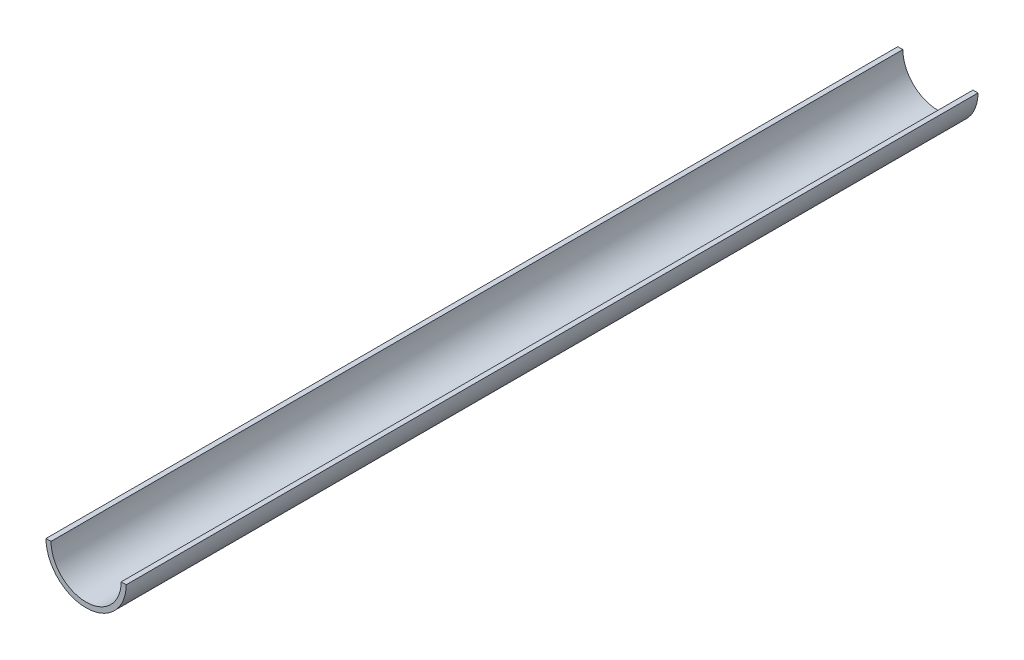
ISO-10303-21;
HEADER;
FILE_DESCRIPTION(('STEP AP214'),'2;1');
FILE_NAME('part.step','',(''),(''),'','','');
FILE_SCHEMA(('AUTOMOTIVE_DESIGN { 1 0 10303 214 1 1 1 1 }'));
ENDSEC;
DATA;
#1=APPLICATION_CONTEXT('core data for automotive mechanical design processes');
#2=APPLICATION_PROTOCOL_DEFINITION('international standard','automotive_design',2000,#1);
#3=PRODUCT_CONTEXT('',#1,'mechanical');
#4=PRODUCT('Part','Part','',(#3));
#5=PRODUCT_RELATED_PRODUCT_CATEGORY('part','',(#4));
#6=PRODUCT_DEFINITION_FORMATION('','',#4);
#7=PRODUCT_DEFINITION_CONTEXT('part definition',#1,'design');
#8=PRODUCT_DEFINITION('design','',#6,#7);
#9=PRODUCT_DEFINITION_SHAPE('','',#8);
#10=(LENGTH_UNIT() NAMED_UNIT(*) SI_UNIT(.MILLI.,.METRE.));
#11=(NAMED_UNIT(*) PLANE_ANGLE_UNIT() SI_UNIT($,.RADIAN.));
#12=(NAMED_UNIT(*) SI_UNIT($,.STERADIAN.) SOLID_ANGLE_UNIT());
#13=UNCERTAINTY_MEASURE_WITH_UNIT(LENGTH_MEASURE(1.E-05),#10,'distance_accuracy_value','');
#14=(GEOMETRIC_REPRESENTATION_CONTEXT(3) GLOBAL_UNCERTAINTY_ASSIGNED_CONTEXT((#13)) GLOBAL_UNIT_ASSIGNED_CONTEXT((#10,
#11,#12)) REPRESENTATION_CONTEXT('',''));
#15=CARTESIAN_POINT('',(0.,0.,0.));
#16=DIRECTION('',(0.,0.,1.));
#17=DIRECTION('',(1.,0.,0.));
#18=AXIS2_PLACEMENT_3D('',#15,#16,#17);
#19=CARTESIAN_POINT('',(0.,0.,0.));
#20=DIRECTION('',(0.,0.,1.));
#21=DIRECTION('',(1.,0.,0.));
#22=AXIS2_PLACEMENT_3D('',#19,#20,#21);
#23=PLANE('',#22);
#24=DIRECTION('',(1.,0.,0.));
#25=VECTOR('',#24,1.);
#26=CARTESIAN_POINT('',(-25.4,0.,0.));
#27=LINE('',#26,#25);
#28=CARTESIAN_POINT('',(22.225,0.,0.));
#29=VERTEX_POINT('',#28);
#30=CARTESIAN_POINT('',(25.4,0.,0.));
#31=VERTEX_POINT('',#30);
#32=EDGE_CURVE('E97',#29,#31,#27,.T.);
#33=ORIENTED_EDGE('',*,*,#32,.T.);
#34=CARTESIAN_POINT('',(0.,0.,0.));
#35=DIRECTION('',(0.,0.,1.));
#36=DIRECTION('',(1.,0.,0.));
#37=AXIS2_PLACEMENT_3D('',#34,#35,#36);
#38=CIRCLE('',#37,25.4);
#39=CARTESIAN_POINT('',(-25.4,0.,0.));
#40=VERTEX_POINT('',#39);
#41=EDGE_CURVE('E40',#40,#31,#38,.T.);
#42=ORIENTED_EDGE('',*,*,#41,.F.);
#43=CARTESIAN_POINT('',(-22.225,0.,0.));
#44=VERTEX_POINT('',#43);
#45=EDGE_CURVE('E98',#40,#44,#27,.T.);
#46=ORIENTED_EDGE('',*,*,#45,.T.);
#47=CARTESIAN_POINT('',(0.,0.,0.));
#48=DIRECTION('',(0.,0.,1.));
#49=DIRECTION('',(1.,0.,0.));
#50=AXIS2_PLACEMENT_3D('',#47,#48,#49);
#51=CIRCLE('',#50,22.225);
#52=EDGE_CURVE('E87',#44,#29,#51,.T.);
#53=ORIENTED_EDGE('',*,*,#52,.T.);
#54=EDGE_LOOP('',(#33,#42,#46,#53));
#55=FACE_BOUND('',#54,.T.);
#56=ADVANCED_FACE('F32',(#55),#23,.F.);
#57=CARTESIAN_POINT('',(0.,0.,914.4));
#58=DIRECTION('',(0.,0.,-1.));
#59=DIRECTION('',(-1.,0.,0.));
#60=AXIS2_PLACEMENT_3D('',#57,#58,#59);
#61=CYLINDRICAL_SURFACE('',#60,25.4);
#62=DIRECTION('',(0.,0.,-1.));
#63=VECTOR('',#62,1.);
#64=CARTESIAN_POINT('',(25.4,0.,539.75));
#65=LINE('',#64,#63);
#66=CARTESIAN_POINT('',(25.4,0.,539.75));
#67=VERTEX_POINT('',#66);
#68=EDGE_CURVE('E71',#67,#31,#65,.T.);
#69=ORIENTED_EDGE('',*,*,#68,.F.);
#70=CARTESIAN_POINT('',(0.,0.,539.75));
#71=DIRECTION('',(0.,0.,-1.));
#72=DIRECTION('',(-1.,0.,0.));
#73=AXIS2_PLACEMENT_3D('',#70,#71,#72);
#74=CIRCLE('',#73,25.4);
#75=CARTESIAN_POINT('',(-25.4,0.,539.75));
#76=VERTEX_POINT('',#75);
#77=EDGE_CURVE('E80',#67,#76,#74,.T.);
#78=ORIENTED_EDGE('',*,*,#77,.T.);
#79=DIRECTION('',(0.,0.,-1.));
#80=VECTOR('',#79,1.);
#81=CARTESIAN_POINT('',(-25.4,0.,539.75));
#82=LINE('',#81,#80);
#83=EDGE_CURVE('E47',#76,#40,#82,.T.);
#84=ORIENTED_EDGE('',*,*,#83,.T.);
#85=ORIENTED_EDGE('',*,*,#41,.T.);
#86=EDGE_LOOP('',(#69,#78,#84,#85));
#87=FACE_BOUND('',#86,.T.);
#88=ADVANCED_FACE('F34',(#87),#61,.T.);
#89=CARTESIAN_POINT('',(0.,0.,914.4));
#90=DIRECTION('',(0.,0.,-1.));
#91=DIRECTION('',(-1.,0.,0.));
#92=AXIS2_PLACEMENT_3D('',#89,#90,#91);
#93=CYLINDRICAL_SURFACE('',#92,22.225);
#94=CARTESIAN_POINT('',(0.,0.,539.75));
#95=DIRECTION('',(0.,0.,-1.));
#96=DIRECTION('',(-1.,0.,0.));
#97=AXIS2_PLACEMENT_3D('',#94,#95,#96);
#98=CIRCLE('',#97,22.225);
#99=CARTESIAN_POINT('',(22.225,0.,539.75));
#100=VERTEX_POINT('',#99);
#101=CARTESIAN_POINT('',(-22.225,0.,539.75));
#102=VERTEX_POINT('',#101);
#103=EDGE_CURVE('E85',#100,#102,#98,.T.);
#104=ORIENTED_EDGE('',*,*,#103,.F.);
#105=DIRECTION('',(0.,0.,-1.));
#106=VECTOR('',#105,1.);
#107=CARTESIAN_POINT('',(22.225,0.,914.4));
#108=LINE('',#107,#106);
#109=EDGE_CURVE('E54',#100,#29,#108,.T.);
#110=ORIENTED_EDGE('',*,*,#109,.T.);
#111=ORIENTED_EDGE('',*,*,#52,.F.);
#112=DIRECTION('',(0.,0.,-1.));
#113=VECTOR('',#112,1.);
#114=CARTESIAN_POINT('',(-22.225,0.,914.4));
#115=LINE('',#114,#113);
#116=EDGE_CURVE('E88',#44,#102,#115,.F.);
#117=ORIENTED_EDGE('',*,*,#116,.T.);
#118=EDGE_LOOP('',(#104,#110,#111,#117));
#119=FACE_BOUND('',#118,.T.);
#120=ADVANCED_FACE('F101',(#119),#93,.F.);
#121=CARTESIAN_POINT('',(0.,0.,539.75));
#122=DIRECTION('',(0.,0.,-1.));
#123=DIRECTION('',(-1.,0.,0.));
#124=AXIS2_PLACEMENT_3D('',#121,#122,#123);
#125=PLANE('',#124);
#126=DIRECTION('',(1.,0.,0.));
#127=VECTOR('',#126,1.);
#128=CARTESIAN_POINT('',(-25.4,0.,539.75));
#129=LINE('',#128,#127);
#130=EDGE_CURVE('E82',#76,#102,#129,.T.);
#131=ORIENTED_EDGE('',*,*,#130,.F.);
#132=ORIENTED_EDGE('',*,*,#77,.F.);
#133=DIRECTION('',(1.,0.,0.));
#134=VECTOR('',#133,1.);
#135=CARTESIAN_POINT('',(0.,0.,539.75));
#136=LINE('',#135,#134);
#137=EDGE_CURVE('E11',#100,#67,#136,.T.);
#138=ORIENTED_EDGE('',*,*,#137,.F.);
#139=ORIENTED_EDGE('',*,*,#103,.T.);
#140=EDGE_LOOP('',(#131,#132,#138,#139));
#141=FACE_BOUND('',#140,.T.);
#142=ADVANCED_FACE('F84',(#141),#125,.F.);
#143=CARTESIAN_POINT('',(-25.4,0.,539.75));
#144=DIRECTION('',(0.,1.,0.));
#145=DIRECTION('',(0.,0.,1.));
#146=AXIS2_PLACEMENT_3D('',#143,#144,#145);
#147=PLANE('',#146);
#148=ORIENTED_EDGE('',*,*,#137,.T.);
#149=ORIENTED_EDGE('',*,*,#68,.T.);
#150=ORIENTED_EDGE('',*,*,#32,.F.);
#151=ORIENTED_EDGE('',*,*,#109,.F.);
#152=EDGE_LOOP('',(#148,#149,#150,#151));
#153=FACE_BOUND('',#152,.T.);
#154=ADVANCED_FACE('F70',(#153),#147,.T.);
#155=ORIENTED_EDGE('',*,*,#45,.F.);
#156=ORIENTED_EDGE('',*,*,#83,.F.);
#157=ORIENTED_EDGE('',*,*,#130,.T.);
#158=ORIENTED_EDGE('',*,*,#116,.F.);
#159=EDGE_LOOP('',(#155,#156,#157,#158));
#160=FACE_BOUND('',#159,.T.);
#161=ADVANCED_FACE('F105',(#160),#147,.T.);
#162=CLOSED_SHELL('',(#56,#88,#120,#142,#154,#161));
#163=MANIFOLD_SOLID_BREP('B2',#162);
#164=ADVANCED_BREP_SHAPE_REPRESENTATION('',(#18,#163),#14);
#165=SHAPE_DEFINITION_REPRESENTATION(#9,#164);
ENDSEC;
END-ISO-10303-21;
